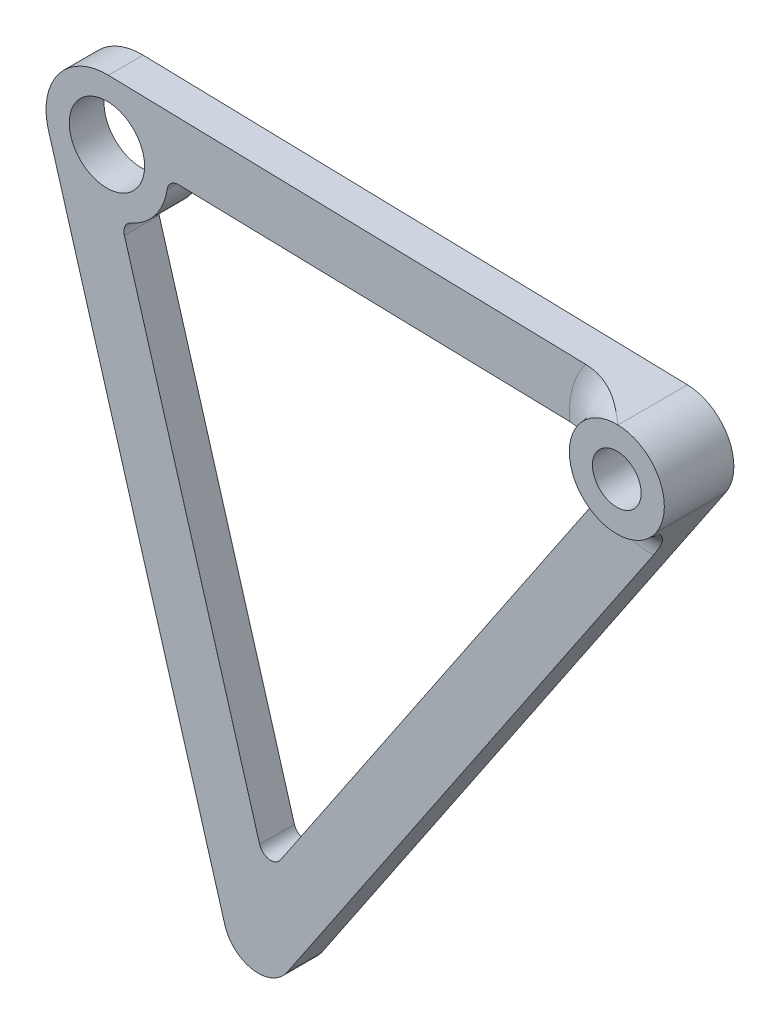
ISO-10303-21;
HEADER;
FILE_DESCRIPTION(('STEP AP214'),'2;1');
FILE_NAME('part.step','',(''),(''),'','','');
FILE_SCHEMA(('AUTOMOTIVE_DESIGN { 1 0 10303 214 1 1 1 1 }'));
ENDSEC;
DATA;
#1=APPLICATION_CONTEXT('core data for automotive mechanical design processes');
#2=APPLICATION_PROTOCOL_DEFINITION('international standard','automotive_design',2000,#1);
#3=PRODUCT_CONTEXT('',#1,'mechanical');
#4=PRODUCT('Part','Part','',(#3));
#5=PRODUCT_RELATED_PRODUCT_CATEGORY('part','',(#4));
#6=PRODUCT_DEFINITION_FORMATION('','',#4);
#7=PRODUCT_DEFINITION_CONTEXT('part definition',#1,'design');
#8=PRODUCT_DEFINITION('design','',#6,#7);
#9=PRODUCT_DEFINITION_SHAPE('','',#8);
#10=(LENGTH_UNIT() NAMED_UNIT(*) SI_UNIT(.MILLI.,.METRE.));
#11=(NAMED_UNIT(*) PLANE_ANGLE_UNIT() SI_UNIT($,.RADIAN.));
#12=(NAMED_UNIT(*) SI_UNIT($,.STERADIAN.) SOLID_ANGLE_UNIT());
#13=UNCERTAINTY_MEASURE_WITH_UNIT(LENGTH_MEASURE(1.E-05),#10,'distance_accuracy_value','');
#14=(GEOMETRIC_REPRESENTATION_CONTEXT(3) GLOBAL_UNCERTAINTY_ASSIGNED_CONTEXT((#13)) GLOBAL_UNIT_ASSIGNED_CONTEXT((#10,
#11,#12)) REPRESENTATION_CONTEXT('',''));
#15=CARTESIAN_POINT('',(0.,0.,0.));
#16=DIRECTION('',(0.,0.,1.));
#17=DIRECTION('',(1.,0.,0.));
#18=AXIS2_PLACEMENT_3D('',#15,#16,#17);
#19=CARTESIAN_POINT('',(47.,0.,-1.5));
#20=DIRECTION('',(0.,0.,1.));
#21=DIRECTION('',(-1.,0.,0.));
#22=AXIS2_PLACEMENT_3D('',#19,#20,#21);
#23=CYLINDRICAL_SURFACE('',#22,4.1);
#24=CARTESIAN_POINT('',(47.,0.,-1.5));
#25=DIRECTION('',(0.,0.,-1.));
#26=DIRECTION('',(-1.,0.,0.));
#27=AXIS2_PLACEMENT_3D('',#24,#25,#26);
#28=CIRCLE('',#27,4.1);
#29=CARTESIAN_POINT('',(43.6084392169331,-2.30376115401807,-1.5));
#30=VERTEX_POINT('',#29);
#31=CARTESIAN_POINT('',(43.1589140163209,-1.43389625356359,-1.5));
#32=VERTEX_POINT('',#31);
#33=EDGE_CURVE('E599',#30,#32,#28,.T.);
#34=ORIENTED_EDGE('',*,*,#33,.F.);
#35=DIRECTION('',(0.,0.,1.));
#36=VECTOR('',#35,1.);
#37=CARTESIAN_POINT('',(43.6084392169331,-2.30376115401808,-1.5));
#38=LINE('',#37,#36);
#39=CARTESIAN_POINT('',(43.6084392169331,-2.30376115401807,4.5));
#40=VERTEX_POINT('',#39);
#41=EDGE_CURVE('E572',#40,#30,#38,.F.);
#42=ORIENTED_EDGE('',*,*,#41,.F.);
#43=CARTESIAN_POINT('',(47.,0.,4.5));
#44=DIRECTION('',(0.,0.,-1.));
#45=DIRECTION('',(-1.,0.,0.));
#46=AXIS2_PLACEMENT_3D('',#43,#44,#45);
#47=CIRCLE('',#46,4.1);
#48=CARTESIAN_POINT('',(43.1589140163209,-1.43389625356359,4.5));
#49=VERTEX_POINT('',#48);
#50=EDGE_CURVE('E346',#40,#49,#47,.T.);
#51=ORIENTED_EDGE('',*,*,#50,.T.);
#52=DIRECTION('',(0.,0.,1.));
#53=VECTOR('',#52,1.);
#54=CARTESIAN_POINT('',(43.1589140163209,-1.43389625356359,-1.5));
#55=LINE('',#54,#53);
#56=EDGE_CURVE('E574',#32,#49,#55,.T.);
#57=ORIENTED_EDGE('',*,*,#56,.F.);
#58=EDGE_LOOP('',(#34,#42,#51,#57));
#59=FACE_BOUND('',#58,.T.);
#60=ADVANCED_FACE('F41',(#59),#23,.T.);
#61=CARTESIAN_POINT('',(0.,0.,-1.5));
#62=DIRECTION('',(0.,0.,-1.));
#63=DIRECTION('',(1.,0.,0.));
#64=AXIS2_PLACEMENT_3D('',#61,#62,#63);
#65=PLANE('',#64);
#66=CARTESIAN_POINT('',(0.,0.,-1.5));
#67=DIRECTION('',(0.,0.,1.));
#68=DIRECTION('',(1.,0.,0.));
#69=AXIS2_PLACEMENT_3D('',#66,#67,#68);
#70=CIRCLE('',#69,3.25);
#71=CARTESIAN_POINT('',(3.25,0.,-1.5));
#72=VERTEX_POINT('',#71);
#73=EDGE_CURVE('E220',#72,#72,#70,.T.);
#74=ORIENTED_EDGE('',*,*,#73,.T.);
#75=EDGE_LOOP('',(#74));
#76=FACE_BOUND('',#75,.T.);
#77=CARTESIAN_POINT('',(0.,0.,-1.5));
#78=DIRECTION('',(0.,0.,1.));
#79=DIRECTION('',(1.,0.,0.));
#80=AXIS2_PLACEMENT_3D('',#77,#78,#79);
#81=CIRCLE('',#80,5.25);
#82=CARTESIAN_POINT('',(0.128457446808512,5.24842821084174,-1.5));
#83=VERTEX_POINT('',#82);
#84=CARTESIAN_POINT('',(-5.0367083067548,-1.48123915444711,-1.5));
#85=VERTEX_POINT('',#84);
#86=EDGE_CURVE('E192',#83,#85,#81,.T.);
#87=ORIENTED_EDGE('',*,*,#86,.F.);
#88=DIRECTION('',(-0.999700611588903,0.0244680851063828,0.));
#89=VECTOR('',#88,1.);
#90=CARTESIAN_POINT('',(47.1003191489362,4.09877250751451,-1.5));
#91=LINE('',#90,#89);
#92=CARTESIAN_POINT('',(47.1003191489362,4.09877250751451,-1.5));
#93=VERTEX_POINT('',#92);
#94=EDGE_CURVE('E216',#93,#83,#91,.T.);
#95=ORIENTED_EDGE('',*,*,#94,.F.);
#96=CARTESIAN_POINT('',(47.,0.,-1.5));
#97=DIRECTION('',(0.,0.,1.));
#98=DIRECTION('',(1.,0.,0.));
#99=AXIS2_PLACEMENT_3D('',#96,#97,#98);
#100=CIRCLE('',#99,4.1);
#101=CARTESIAN_POINT('',(50.4014418271624,-2.28914689271571,-1.5));
#102=VERTEX_POINT('',#101);
#103=EDGE_CURVE('E213',#102,#93,#100,.T.);
#104=ORIENTED_EDGE('',*,*,#103,.F.);
#105=DIRECTION('',(0.558328510418464,0.829619957844493,0.));
#106=VECTOR('',#105,1.);
#107=CARTESIAN_POINT('',(15.5526422359154,-54.0709547501593,-1.5));
#108=LINE('',#107,#106);
#109=CARTESIAN_POINT('',(15.5526422359154,-54.0709547501592,-1.5));
#110=VERTEX_POINT('',#109);
#111=EDGE_CURVE('E210',#110,#102,#108,.T.);
#112=ORIENTED_EDGE('',*,*,#111,.F.);
#113=CARTESIAN_POINT('',(13.0637823623819,-52.3959692189039,-1.5));
#114=DIRECTION('',(0.,0.,1.));
#115=DIRECTION('',(1.,0.,0.));
#116=AXIS2_PLACEMENT_3D('',#113,#114,#115);
#117=CIRCLE('',#116,3.);
#118=CARTESIAN_POINT('',(10.1856633299506,-53.2423915928736,-1.5));
#119=VERTEX_POINT('',#118);
#120=EDGE_CURVE('E195',#119,#110,#117,.T.);
#121=ORIENTED_EDGE('',*,*,#120,.F.);
#122=DIRECTION('',(0.282140791323259,-0.959373010810438,0.));
#123=VECTOR('',#122,1.);
#124=CARTESIAN_POINT('',(-5.0367083067548,-1.48123915444711,-1.5));
#125=LINE('',#124,#123);
#126=EDGE_CURVE('E176',#85,#119,#125,.T.);
#127=ORIENTED_EDGE('',*,*,#126,.F.);
#128=EDGE_LOOP('',(#87,#95,#104,#112,#121,#127));
#129=FACE_BOUND('',#128,.T.);
#130=CARTESIAN_POINT('',(47.,0.,-1.5));
#131=DIRECTION('',(0.,0.,1.));
#132=DIRECTION('',(1.,0.,0.));
#133=AXIS2_PLACEMENT_3D('',#130,#131,#132);
#134=CIRCLE('',#133,2.09999999999999);
#135=CARTESIAN_POINT('',(49.1,0.,-1.5));
#136=VERTEX_POINT('',#135);
#137=EDGE_CURVE('E604',#136,#136,#134,.T.);
#138=ORIENTED_EDGE('',*,*,#137,.T.);
#139=EDGE_LOOP('',(#138));
#140=FACE_BOUND('',#139,.T.);
#141=DIRECTION('',(0.282140791323259,-0.959373010810438,0.));
#142=VECTOR('',#141,1.);
#143=CARTESIAN_POINT('',(13.7814187401358,-47.7475133134107,-1.5));
#144=LINE('',#143,#142);
#145=CARTESIAN_POINT('',(1.51079431856902,-6.0232881822954,-1.5));
#146=VERTEX_POINT('',#145);
#147=CARTESIAN_POINT('',(13.1808639182024,-45.7054261519874,-1.5));
#148=VERTEX_POINT('',#147);
#149=EDGE_CURVE('E594',#146,#148,#144,.T.);
#150=ORIENTED_EDGE('',*,*,#149,.T.);
#151=CARTESIAN_POINT('',(14.1402369290128,-45.4232853606641,-1.5));
#152=DIRECTION('',(0.,0.,1.));
#153=DIRECTION('',(1.,0.,0.));
#154=AXIS2_PLACEMENT_3D('',#151,#152,#153);
#155=CIRCLE('',#154,1.);
#156=CARTESIAN_POINT('',(14.9698568868573,-45.9816138710826,-1.5));
#157=VERTEX_POINT('',#156);
#158=EDGE_CURVE('E284',#157,#148,#155,.F.);
#159=ORIENTED_EDGE('',*,*,#158,.F.);
#160=DIRECTION('',(0.558328510418464,0.829619957844493,0.));
#161=VECTOR('',#160,1.);
#162=CARTESIAN_POINT('',(44.0200279962661,-2.81598417200135,-1.5));
#163=LINE('',#162,#161);
#164=CARTESIAN_POINT('',(43.6108492276881,-3.4239826288312,-1.5));
#165=VERTEX_POINT('',#164);
#166=EDGE_CURVE('E596',#157,#165,#163,.T.);
#167=ORIENTED_EDGE('',*,*,#166,.T.);
#168=CARTESIAN_POINT('',(42.7812292698436,-2.86565411841273,-1.5));
#169=DIRECTION('',(0.,0.,1.));
#170=DIRECTION('',(1.,0.,0.));
#171=AXIS2_PLACEMENT_3D('',#168,#169,#170);
#172=CIRCLE('',#171,1.);
#173=EDGE_CURVE('E11',#30,#165,#172,.F.);
#174=ORIENTED_EDGE('',*,*,#173,.F.);
#175=ORIENTED_EDGE('',*,*,#33,.T.);
#176=CARTESIAN_POINT('',(42.2220637763991,-1.78362704711569,-1.5));
#177=DIRECTION('',(0.,0.,1.));
#178=DIRECTION('',(1.,0.,0.));
#179=AXIS2_PLACEMENT_3D('',#176,#177,#178);
#180=CIRCLE('',#179,1.);
#181=CARTESIAN_POINT('',(42.2465318615055,-0.783926435526787,-1.5));
#182=VERTEX_POINT('',#181);
#183=EDGE_CURVE('E65',#182,#32,#180,.F.);
#184=ORIENTED_EDGE('',*,*,#183,.F.);
#185=DIRECTION('',(-0.999700611588903,0.024468085106383,0.));
#186=VECTOR('',#185,1.);
#187=CARTESIAN_POINT('',(42.9791762770487,-0.801858210004482,-1.5));
#188=LINE('',#187,#186);
#189=CARTESIAN_POINT('',(6.20909618803447,0.0981046774409536,-1.5));
#190=VERTEX_POINT('',#189);
#191=EDGE_CURVE('E560',#182,#190,#188,.T.);
#192=ORIENTED_EDGE('',*,*,#191,.T.);
#193=CARTESIAN_POINT('',(6.18462810292808,-0.901595934147949,-1.5));
#194=DIRECTION('',(0.,0.,1.));
#195=DIRECTION('',(1.,0.,0.));
#196=AXIS2_PLACEMENT_3D('',#193,#194,#195);
#197=CIRCLE('',#196,1.);
#198=CARTESIAN_POINT('',(5.19508760645959,-0.757340584684277,-1.5));
#199=VERTEX_POINT('',#198);
#200=EDGE_CURVE('E584',#199,#190,#197,.F.);
#201=ORIENTED_EDGE('',*,*,#200,.F.);
#202=CARTESIAN_POINT('',(0.,0.,-1.5));
#203=DIRECTION('',(0.,0.,-1.));
#204=DIRECTION('',(1.,0.,0.));
#205=AXIS2_PLACEMENT_3D('',#202,#203,#204);
#206=CIRCLE('',#205,5.25);
#207=CARTESIAN_POINT('',(2.07494055667874,-4.8225638084166,-1.5));
#208=VERTEX_POINT('',#207);
#209=EDGE_CURVE('E597',#199,#208,#206,.T.);
#210=ORIENTED_EDGE('',*,*,#209,.T.);
#211=CARTESIAN_POINT('',(2.47016732937945,-5.74114739097215,-1.5));
#212=DIRECTION('',(0.,0.,1.));
#213=DIRECTION('',(1.,0.,0.));
#214=AXIS2_PLACEMENT_3D('',#211,#212,#213);
#215=CIRCLE('',#214,1.);
#216=EDGE_CURVE('E579',#146,#208,#215,.F.);
#217=ORIENTED_EDGE('',*,*,#216,.F.);
#218=EDGE_LOOP('',(#150,#159,#167,#174,#175,#184,#192,#201,#210,#217));
#219=FACE_BOUND('',#218,.T.);
#220=ADVANCED_FACE('F189',(#76,#129,#140,#219),#65,.T.);
#221=CARTESIAN_POINT('',(0.,0.,1.5));
#222=DIRECTION('',(0.,0.,-1.));
#223=DIRECTION('',(1.,0.,0.));
#224=AXIS2_PLACEMENT_3D('',#221,#222,#223);
#225=PLANE('',#224);
#226=DIRECTION('',(0.282140791323259,-0.959373010810438,0.));
#227=VECTOR('',#226,1.);
#228=CARTESIAN_POINT('',(13.7814187401358,-47.7475133134107,1.5));
#229=LINE('',#228,#227);
#230=CARTESIAN_POINT('',(1.51079431856902,-6.0232881822954,1.5));
#231=VERTEX_POINT('',#230);
#232=CARTESIAN_POINT('',(13.1808639182024,-45.7054261519874,1.5));
#233=VERTEX_POINT('',#232);
#234=EDGE_CURVE('E348',#231,#233,#229,.T.);
#235=ORIENTED_EDGE('',*,*,#234,.F.);
#236=CARTESIAN_POINT('',(2.47016732937945,-5.74114739097215,1.5));
#237=DIRECTION('',(0.,0.,1.));
#238=DIRECTION('',(1.,0.,0.));
#239=AXIS2_PLACEMENT_3D('',#236,#237,#238);
#240=CIRCLE('',#239,1.);
#241=CARTESIAN_POINT('',(2.07494055667874,-4.8225638084166,1.5));
#242=VERTEX_POINT('',#241);
#243=EDGE_CURVE('E576',#242,#231,#240,.T.);
#244=ORIENTED_EDGE('',*,*,#243,.F.);
#245=CARTESIAN_POINT('',(0.,0.,1.5));
#246=DIRECTION('',(0.,0.,-1.));
#247=DIRECTION('',(1.,0.,0.));
#248=AXIS2_PLACEMENT_3D('',#245,#246,#247);
#249=CIRCLE('',#248,5.25);
#250=CARTESIAN_POINT('',(5.19508760645959,-0.757340584684277,1.5));
#251=VERTEX_POINT('',#250);
#252=EDGE_CURVE('E344',#251,#242,#249,.T.);
#253=ORIENTED_EDGE('',*,*,#252,.F.);
#254=CARTESIAN_POINT('',(6.18462810292808,-0.901595934147949,1.5));
#255=DIRECTION('',(0.,0.,1.));
#256=DIRECTION('',(1.,0.,0.));
#257=AXIS2_PLACEMENT_3D('',#254,#255,#256);
#258=CIRCLE('',#257,1.);
#259=CARTESIAN_POINT('',(6.20909618803447,0.0981046774409536,1.5));
#260=VERTEX_POINT('',#259);
#261=EDGE_CURVE('E581',#260,#251,#258,.T.);
#262=ORIENTED_EDGE('',*,*,#261,.F.);
#263=DIRECTION('',(-0.999700611588903,0.024468085106383,0.));
#264=VECTOR('',#263,1.);
#265=CARTESIAN_POINT('',(42.9791762770487,-0.801858210004482,1.5));
#266=LINE('',#265,#264);
#267=CARTESIAN_POINT('',(39.9373604895105,-0.727408513060585,1.5));
#268=VERTEX_POINT('',#267);
#269=EDGE_CURVE('E548',#268,#260,#266,.T.);
#270=ORIENTED_EDGE('',*,*,#269,.F.);
#271=CARTESIAN_POINT('',(47.,0.,1.5));
#272=DIRECTION('',(0.,0.,1.));
#273=DIRECTION('',(1.,0.,0.));
#274=AXIS2_PLACEMENT_3D('',#271,#272,#273);
#275=CIRCLE('',#274,7.1);
#276=CARTESIAN_POINT('',(41.3055038705639,4.24060300332827,1.5));
#277=VERTEX_POINT('',#276);
#278=EDGE_CURVE('E184',#277,#268,#275,.T.);
#279=ORIENTED_EDGE('',*,*,#278,.F.);
#280=DIRECTION('',(-0.999700611588903,0.0244680851063828,0.));
#281=VECTOR('',#280,1.);
#282=CARTESIAN_POINT('',(47.1003191489362,4.09877250751451,1.5));
#283=LINE('',#282,#281);
#284=CARTESIAN_POINT('',(0.128457446808512,5.24842821084174,1.5));
#285=VERTEX_POINT('',#284);
#286=EDGE_CURVE('E200',#277,#285,#283,.T.);
#287=ORIENTED_EDGE('',*,*,#286,.T.);
#288=CARTESIAN_POINT('',(0.,0.,1.5));
#289=DIRECTION('',(0.,0.,1.));
#290=DIRECTION('',(1.,0.,0.));
#291=AXIS2_PLACEMENT_3D('',#288,#289,#290);
#292=CIRCLE('',#291,5.25);
#293=CARTESIAN_POINT('',(-5.0367083067548,-1.48123915444711,1.5));
#294=VERTEX_POINT('',#293);
#295=EDGE_CURVE('E218',#285,#294,#292,.T.);
#296=ORIENTED_EDGE('',*,*,#295,.T.);
#297=DIRECTION('',(0.282140791323259,-0.959373010810438,0.));
#298=VECTOR('',#297,1.);
#299=CARTESIAN_POINT('',(-5.0367083067548,-1.48123915444711,1.5));
#300=LINE('',#299,#298);
#301=CARTESIAN_POINT('',(10.1856633299506,-53.2423915928736,1.5));
#302=VERTEX_POINT('',#301);
#303=EDGE_CURVE('E179',#294,#302,#300,.T.);
#304=ORIENTED_EDGE('',*,*,#303,.T.);
#305=CARTESIAN_POINT('',(13.0637823623819,-52.3959692189039,1.5));
#306=DIRECTION('',(0.,0.,1.));
#307=DIRECTION('',(1.,0.,0.));
#308=AXIS2_PLACEMENT_3D('',#305,#306,#307);
#309=CIRCLE('',#308,3.);
#310=CARTESIAN_POINT('',(15.5526422359154,-54.0709547501592,1.5));
#311=VERTEX_POINT('',#310);
#312=EDGE_CURVE('E222',#302,#311,#309,.T.);
#313=ORIENTED_EDGE('',*,*,#312,.T.);
#314=DIRECTION('',(0.558328510418464,0.829619957844493,0.));
#315=VECTOR('',#314,1.);
#316=CARTESIAN_POINT('',(15.5526422359154,-54.0709547501593,1.5));
#317=LINE('',#316,#315);
#318=CARTESIAN_POINT('',(47.1650623101173,-7.09808103882866,1.5));
#319=VERTEX_POINT('',#318);
#320=EDGE_CURVE('E203',#311,#319,#317,.T.);
#321=ORIENTED_EDGE('',*,*,#320,.T.);
#322=CARTESIAN_POINT('',(47.,0.,1.5));
#323=DIRECTION('',(0.,0.,1.));
#324=DIRECTION('',(1.,0.,0.));
#325=AXIS2_PLACEMENT_3D('',#322,#323,#324);
#326=CIRCLE('',#325,7.1);
#327=CARTESIAN_POINT('',(42.3211869053076,-5.34029100564149,1.5));
#328=VERTEX_POINT('',#327);
#329=EDGE_CURVE('E239',#328,#319,#326,.T.);
#330=ORIENTED_EDGE('',*,*,#329,.F.);
#331=DIRECTION('',(0.558328510418464,0.829619957844493,0.));
#332=VECTOR('',#331,1.);
#333=CARTESIAN_POINT('',(44.0200279962661,-2.81598417200135,1.5));
#334=LINE('',#333,#332);
#335=CARTESIAN_POINT('',(14.9698568868573,-45.9816138710826,1.5));
#336=VERTEX_POINT('',#335);
#337=EDGE_CURVE('E542',#336,#328,#334,.T.);
#338=ORIENTED_EDGE('',*,*,#337,.F.);
#339=CARTESIAN_POINT('',(14.1402369290128,-45.4232853606641,1.5));
#340=DIRECTION('',(0.,0.,1.));
#341=DIRECTION('',(1.,0.,0.));
#342=AXIS2_PLACEMENT_3D('',#339,#340,#341);
#343=CIRCLE('',#342,1.);
#344=EDGE_CURVE('E586',#233,#336,#343,.T.);
#345=ORIENTED_EDGE('',*,*,#344,.F.);
#346=EDGE_LOOP('',(#235,#244,#253,#262,#270,#279,#287,#296,#304,#313,#321,#330,#338,#345));
#347=FACE_BOUND('',#346,.T.);
#348=CARTESIAN_POINT('',(0.,0.,1.5));
#349=DIRECTION('',(0.,0.,1.));
#350=DIRECTION('',(1.,0.,0.));
#351=AXIS2_PLACEMENT_3D('',#348,#349,#350);
#352=CIRCLE('',#351,3.25);
#353=CARTESIAN_POINT('',(3.25,0.,1.5));
#354=VERTEX_POINT('',#353);
#355=EDGE_CURVE('E206',#354,#354,#352,.T.);
#356=ORIENTED_EDGE('',*,*,#355,.F.);
#357=EDGE_LOOP('',(#356));
#358=FACE_BOUND('',#357,.T.);
#359=ADVANCED_FACE('F311',(#347,#358),#225,.F.);
#360=CARTESIAN_POINT('',(0.,0.,-1.5));
#361=DIRECTION('',(0.,0.,1.));
#362=DIRECTION('',(-1.,0.,0.));
#363=AXIS2_PLACEMENT_3D('',#360,#361,#362);
#364=CYLINDRICAL_SURFACE('',#363,5.25);
#365=ORIENTED_EDGE('',*,*,#295,.F.);
#366=DIRECTION('',(0.,0.,1.));
#367=VECTOR('',#366,1.);
#368=CARTESIAN_POINT('',(0.128457446808512,5.24842821084174,-1.5));
#369=LINE('',#368,#367);
#370=EDGE_CURVE('E198',#83,#285,#369,.T.);
#371=ORIENTED_EDGE('',*,*,#370,.F.);
#372=ORIENTED_EDGE('',*,*,#86,.T.);
#373=DIRECTION('',(0.,0.,1.));
#374=VECTOR('',#373,1.);
#375=CARTESIAN_POINT('',(-5.0367083067548,-1.48123915444711,-1.5));
#376=LINE('',#375,#374);
#377=EDGE_CURVE('E173',#85,#294,#376,.T.);
#378=ORIENTED_EDGE('',*,*,#377,.T.);
#379=EDGE_LOOP('',(#365,#371,#372,#378));
#380=FACE_BOUND('',#379,.T.);
#381=ADVANCED_FACE('F197',(#380),#364,.T.);
#382=CARTESIAN_POINT('',(-5.0367083067548,-1.48123915444711,-1.5));
#383=DIRECTION('',(0.959373010810438,0.282140791323259,0.));
#384=DIRECTION('',(-0.282140791323259,0.959373010810438,0.));
#385=AXIS2_PLACEMENT_3D('',#382,#383,#384);
#386=PLANE('',#385);
#387=ORIENTED_EDGE('',*,*,#303,.F.);
#388=ORIENTED_EDGE('',*,*,#377,.F.);
#389=ORIENTED_EDGE('',*,*,#126,.T.);
#390=DIRECTION('',(0.,0.,1.));
#391=VECTOR('',#390,1.);
#392=CARTESIAN_POINT('',(10.1856633299506,-53.2423915928736,-1.5));
#393=LINE('',#392,#391);
#394=EDGE_CURVE('E185',#119,#302,#393,.T.);
#395=ORIENTED_EDGE('',*,*,#394,.T.);
#396=EDGE_LOOP('',(#387,#388,#389,#395));
#397=FACE_BOUND('',#396,.T.);
#398=ADVANCED_FACE('F175',(#397),#386,.F.);
#399=CARTESIAN_POINT('',(13.0637823623819,-52.3959692189039,-1.5));
#400=DIRECTION('',(0.,0.,1.));
#401=DIRECTION('',(-1.,0.,0.));
#402=AXIS2_PLACEMENT_3D('',#399,#400,#401);
#403=CYLINDRICAL_SURFACE('',#402,3.);
#404=ORIENTED_EDGE('',*,*,#312,.F.);
#405=ORIENTED_EDGE('',*,*,#394,.F.);
#406=ORIENTED_EDGE('',*,*,#120,.T.);
#407=DIRECTION('',(0.,0.,1.));
#408=VECTOR('',#407,1.);
#409=CARTESIAN_POINT('',(15.5526422359154,-54.0709547501592,-1.5));
#410=LINE('',#409,#408);
#411=EDGE_CURVE('E234',#110,#311,#410,.T.);
#412=ORIENTED_EDGE('',*,*,#411,.T.);
#413=EDGE_LOOP('',(#404,#405,#406,#412));
#414=FACE_BOUND('',#413,.T.);
#415=ADVANCED_FACE('F326',(#414),#403,.T.);
#416=CARTESIAN_POINT('',(15.5526422359154,-54.0709547501593,-1.5));
#417=DIRECTION('',(-0.829619957844493,0.558328510418464,0.));
#418=DIRECTION('',(-0.558328510418464,-0.829619957844494,0.));
#419=AXIS2_PLACEMENT_3D('',#416,#417,#418);
#420=PLANE('',#419);
#421=ORIENTED_EDGE('',*,*,#320,.F.);
#422=ORIENTED_EDGE('',*,*,#411,.F.);
#423=ORIENTED_EDGE('',*,*,#111,.T.);
#424=DIRECTION('',(0.,0.,1.));
#425=VECTOR('',#424,1.);
#426=CARTESIAN_POINT('',(50.4014418271624,-2.28914689271571,-1.5));
#427=LINE('',#426,#425);
#428=CARTESIAN_POINT('',(50.4014418271624,-2.2891468927157,4.5));
#429=VERTEX_POINT('',#428);
#430=EDGE_CURVE('E231',#102,#429,#427,.T.);
#431=ORIENTED_EDGE('',*,*,#430,.T.);
#432=CARTESIAN_POINT('',(47.1650623101173,-7.09808103882865,1.5));
#433=CARTESIAN_POINT('',(47.2363930602177,-6.9920907252641,1.49999294841604));
#434=CARTESIAN_POINT('',(47.3076876111188,-6.88615420006532,1.50543769285002));
#435=CARTESIAN_POINT('',(47.4497408814415,-6.67507734130261,1.52643615494527));
#436=CARTESIAN_POINT('',(47.5205000860848,-6.56993628674802,1.54197922068617));
#437=CARTESIAN_POINT('',(47.6604508082962,-6.36198360280885,1.58217611628572));
#438=CARTESIAN_POINT('',(47.7296509594415,-6.25915914479753,1.60673501398968));
#439=CARTESIAN_POINT('',(47.8669651080827,-6.05512414375182,1.66420013503758));
#440=CARTESIAN_POINT('',(47.9350788740056,-5.95391394481123,1.69710811344207));
#441=CARTESIAN_POINT('',(48.1129503188136,-5.68961488468849,1.79385491692366));
#442=CARTESIAN_POINT('',(48.2216389947548,-5.528114454261,1.86405393823637));
#443=CARTESIAN_POINT('',(48.4350914404162,-5.21094560891825,2.02145684501459));
#444=CARTESIAN_POINT('',(48.5398531716585,-5.0552802229758,2.10866942038795));
#445=CARTESIAN_POINT('',(48.8491892179887,-4.59563799993415,2.39221780608383));
#446=CARTESIAN_POINT('',(49.0476822966213,-4.30069726799099,2.60978784015491));
#447=CARTESIAN_POINT('',(49.4429239818752,-3.71340791389191,3.09404088743079));
#448=CARTESIAN_POINT('',(49.6387795846286,-3.42238620558227,3.36295064544719));
#449=CARTESIAN_POINT('',(50.0217707801127,-2.85329984598713,3.91846483691301));
#450=CARTESIAN_POINT('',(50.2089188359539,-2.57521667577395,4.20504252389094));
#451=CARTESIAN_POINT('',(50.3978195387798,-2.29452924858542,4.49445039728559));
#452=CARTESIAN_POINT('',(50.3996306838312,-2.29183806937264,4.49722520011662));
#453=CARTESIAN_POINT('',(50.4014418271624,-2.2891468927157,4.5));
#454=B_SPLINE_CURVE_WITH_KNOTS('',3,(#432,#433,#434,#435,#436,#437,#438,#439,#440,#441,#442,
#443,#444,#445,#446,#447,#448,#449,#450,#451,#452,#453),.UNSPECIFIED.,.F.,.F.,(4,2,2,2,2,2,2,2,
2,2,4),(0.,0.383062403442689,0.765721399237589,1.14446163732017,1.52328155646243,
2.14305439451332,2.76314462285962,4.00966185663654,5.33448962406448,6.65735884377311,
6.67016509224793),.UNSPECIFIED.);
#455=EDGE_CURVE('E250',#319,#429,#454,.T.);
#456=ORIENTED_EDGE('',*,*,#455,.F.);
#457=EDGE_LOOP('',(#421,#422,#423,#431,#456));
#458=FACE_BOUND('',#457,.T.);
#459=ADVANCED_FACE('F318',(#458),#420,.F.);
#460=ORIENTED_EDGE('',*,*,#430,.F.);
#461=ORIENTED_EDGE('',*,*,#103,.T.);
#462=DIRECTION('',(0.,0.,1.));
#463=VECTOR('',#462,1.);
#464=CARTESIAN_POINT('',(47.1003191489362,4.09877250751451,-1.5));
#465=LINE('',#464,#463);
#466=CARTESIAN_POINT('',(47.1003191489362,4.0987725075145,4.5));
#467=VERTEX_POINT('',#466);
#468=EDGE_CURVE('E228',#93,#467,#465,.T.);
#469=ORIENTED_EDGE('',*,*,#468,.T.);
#470=EDGE_CURVE('E331',#467,#429,#47,.T.);
#471=ORIENTED_EDGE('',*,*,#470,.T.);
#472=EDGE_LOOP('',(#460,#461,#469,#471));
#473=FACE_BOUND('',#472,.T.);
#474=ADVANCED_FACE('F307',(#473),#23,.T.);
#475=CARTESIAN_POINT('',(47.1003191489362,4.09877250751451,-1.5));
#476=DIRECTION('',(-0.0244680851063828,-0.999700611588903,0.));
#477=DIRECTION('',(0.999700611588903,-0.0244680851063828,0.));
#478=AXIS2_PLACEMENT_3D('',#475,#476,#477);
#479=PLANE('',#478);
#480=ORIENTED_EDGE('',*,*,#468,.F.);
#481=ORIENTED_EDGE('',*,*,#94,.T.);
#482=ORIENTED_EDGE('',*,*,#370,.T.);
#483=ORIENTED_EDGE('',*,*,#286,.F.);
#484=CARTESIAN_POINT('',(41.3055038705639,4.24060300332827,1.5));
#485=CARTESIAN_POINT('',(41.4332232923196,4.23747701776317,1.49999294841604));
#486=CARTESIAN_POINT('',(41.5608778985394,4.23435261858505,1.50543769285001));
#487=CARTESIAN_POINT('',(41.8152276918418,4.22812730240822,1.52643615494524));
#488=CARTESIAN_POINT('',(41.9419237477254,4.22502636414524,1.54197922068613));
#489=CARTESIAN_POINT('',(42.1925088781214,4.21889318964695,1.58217611628566));
#490=CARTESIAN_POINT('',(42.3164134112613,4.21586057505535,1.60673501398963));
#491=CARTESIAN_POINT('',(42.5622776933369,4.20984294526828,1.66420013503754));
#492=CARTESIAN_POINT('',(42.6842370276361,4.20685794022121,1.69710811344205));
#493=CARTESIAN_POINT('',(43.002720122876,4.19906293500771,1.79385491692368));
#494=CARTESIAN_POINT('',(43.1973298083636,4.19429978262805,1.86405393823643));
#495=CARTESIAN_POINT('',(43.579521540455,4.18494548223115,2.0214568450147));
#496=CARTESIAN_POINT('',(43.7670999371154,4.18035442354778,2.10866942038807));
#497=CARTESIAN_POINT('',(44.3209735597806,4.16679813801544,2.39221780608404));
#498=CARTESIAN_POINT('',(44.676380185812,4.15809941414522,2.60978784015533));
#499=CARTESIAN_POINT('',(45.3840699188293,4.14077841582267,3.09404088743038));
#500=CARTESIAN_POINT('',(45.7347540809358,4.13219527620626,3.36295064544568));
#501=CARTESIAN_POINT('',(46.4205090177026,4.11541114107577,3.91846483691433));
#502=CARTESIAN_POINT('',(46.755602107862,4.10720959938063,4.20504252389621));
#503=CARTESIAN_POINT('',(47.0938333545625,4.09893125000889,4.49445039728566));
#504=CARTESIAN_POINT('',(47.0970762532893,4.09885187872401,4.49722520011665));
#505=CARTESIAN_POINT('',(47.1003191489362,4.09877250751451,4.5));
#506=B_SPLINE_CURVE_WITH_KNOTS('',3,(#484,#485,#486,#487,#488,#489,#490,#491,#492,#493,#494,
#495,#496,#497,#498,#499,#500,#501,#502,#503,#504,#505),.UNSPECIFIED.,.F.,.F.,(4,2,2,2,2,2,2,2,
2,2,4),(0.,0.383062403442481,0.765721399237175,1.14446163731997,1.52328155646243,
2.14305439451354,2.76314462286005,4.00966185663654,5.33448962406426,6.65735884377304,
6.67016509224793),.UNSPECIFIED.);
#507=EDGE_CURVE('E336',#467,#277,#506,.F.);
#508=ORIENTED_EDGE('',*,*,#507,.F.);
#509=EDGE_LOOP('',(#480,#481,#482,#483,#508));
#510=FACE_BOUND('',#509,.T.);
#511=ADVANCED_FACE('F317',(#510),#479,.F.);
#512=CARTESIAN_POINT('',(0.,0.,-1.5));
#513=DIRECTION('',(0.,0.,1.));
#514=DIRECTION('',(-1.,0.,0.));
#515=AXIS2_PLACEMENT_3D('',#512,#513,#514);
#516=CYLINDRICAL_SURFACE('',#515,3.25);
#517=ORIENTED_EDGE('',*,*,#73,.F.);
#518=EDGE_LOOP('',(#517));
#519=FACE_BOUND('',#518,.T.);
#520=ORIENTED_EDGE('',*,*,#355,.T.);
#521=EDGE_LOOP('',(#520));
#522=FACE_BOUND('',#521,.T.);
#523=ADVANCED_FACE('F324',(#519,#522),#516,.F.);
#524=CARTESIAN_POINT('',(47.,0.,-1.5));
#525=DIRECTION('',(0.,0.,1.));
#526=DIRECTION('',(-1.,0.,0.));
#527=AXIS2_PLACEMENT_3D('',#524,#525,#526);
#528=CYLINDRICAL_SURFACE('',#527,2.09999999999999);
#529=ORIENTED_EDGE('',*,*,#137,.F.);
#530=EDGE_LOOP('',(#529));
#531=FACE_BOUND('',#530,.T.);
#532=CARTESIAN_POINT('',(47.,0.,4.5));
#533=DIRECTION('',(0.,0.,-1.));
#534=DIRECTION('',(-1.,0.,0.));
#535=AXIS2_PLACEMENT_3D('',#532,#533,#534);
#536=CIRCLE('',#535,2.09999999999999);
#537=CARTESIAN_POINT('',(44.9,0.,4.5));
#538=VERTEX_POINT('',#537);
#539=EDGE_CURVE('E354',#538,#538,#536,.T.);
#540=ORIENTED_EDGE('',*,*,#539,.F.);
#541=EDGE_LOOP('',(#540));
#542=FACE_BOUND('',#541,.T.);
#543=ADVANCED_FACE('F358',(#531,#542),#528,.F.);
#544=CARTESIAN_POINT('',(0.,0.,-1.5));
#545=DIRECTION('',(0.,0.,1.));
#546=DIRECTION('',(-1.,0.,0.));
#547=AXIS2_PLACEMENT_3D('',#544,#545,#546);
#548=CYLINDRICAL_SURFACE('',#547,5.25);
#549=ORIENTED_EDGE('',*,*,#209,.F.);
#550=DIRECTION('',(0.,0.,1.));
#551=VECTOR('',#550,1.);
#552=CARTESIAN_POINT('',(5.19508760645959,-0.757340584684277,-1.5));
#553=LINE('',#552,#551);
#554=EDGE_CURVE('E387',#251,#199,#553,.F.);
#555=ORIENTED_EDGE('',*,*,#554,.F.);
#556=ORIENTED_EDGE('',*,*,#252,.T.);
#557=DIRECTION('',(0.,0.,1.));
#558=VECTOR('',#557,1.);
#559=CARTESIAN_POINT('',(2.07494055667874,-4.82256380841661,-1.5));
#560=LINE('',#559,#558);
#561=EDGE_CURVE('E619',#208,#242,#560,.T.);
#562=ORIENTED_EDGE('',*,*,#561,.F.);
#563=EDGE_LOOP('',(#549,#555,#556,#562));
#564=FACE_BOUND('',#563,.T.);
#565=ADVANCED_FACE('F360',(#564),#548,.T.);
#566=CARTESIAN_POINT('',(13.7814187401358,-47.7475133134107,-1.5));
#567=DIRECTION('',(0.959373010810438,0.282140791323258,0.));
#568=DIRECTION('',(-0.282140791323259,0.959373010810439,0.));
#569=AXIS2_PLACEMENT_3D('',#566,#567,#568);
#570=PLANE('',#569);
#571=ORIENTED_EDGE('',*,*,#234,.T.);
#572=DIRECTION('',(0.,0.,1.));
#573=VECTOR('',#572,1.);
#574=CARTESIAN_POINT('',(13.1808639182024,-45.7054261519874,1.5));
#575=LINE('',#574,#573);
#576=EDGE_CURVE('E566',#148,#233,#575,.T.);
#577=ORIENTED_EDGE('',*,*,#576,.F.);
#578=ORIENTED_EDGE('',*,*,#149,.F.);
#579=DIRECTION('',(0.,0.,-1.));
#580=VECTOR('',#579,1.);
#581=CARTESIAN_POINT('',(1.51079431856902,-6.02328818229541,-1.5));
#582=LINE('',#581,#580);
#583=EDGE_CURVE('E562',#231,#146,#582,.T.);
#584=ORIENTED_EDGE('',*,*,#583,.F.);
#585=EDGE_LOOP('',(#571,#577,#578,#584));
#586=FACE_BOUND('',#585,.T.);
#587=ADVANCED_FACE('F367',(#586),#570,.T.);
#588=CARTESIAN_POINT('',(44.0200279962661,-2.81598417200135,-1.5));
#589=DIRECTION('',(-0.829619957844493,0.558328510418464,0.));
#590=DIRECTION('',(-0.558328510418464,-0.829619957844494,0.));
#591=AXIS2_PLACEMENT_3D('',#588,#589,#590);
#592=PLANE('',#591);
#593=ORIENTED_EDGE('',*,*,#337,.T.);
#594=CARTESIAN_POINT('',(44.0200279962661,-2.81598417200136,4.5));
#595=CARTESIAN_POINT('',(44.0200337897389,-2.81597556348401,4.41683052112646));
#596=CARTESIAN_POINT('',(44.018048770211,-2.81892510266456,4.33366608103657));
#597=CARTESIAN_POINT('',(44.0101417842937,-2.83067408771716,4.16795001340954));
#598=CARTESIAN_POINT('',(44.0042203186238,-2.83947278957061,4.0853983092821));
#599=CARTESIAN_POINT('',(43.9884978251695,-2.86283483201224,3.92162156301453));
#600=CARTESIAN_POINT('',(43.9787030884697,-2.87738882468212,3.84039459087034));
#601=CARTESIAN_POINT('',(43.9553296312722,-2.91211942900016,3.67972947820321));
#602=CARTESIAN_POINT('',(43.9417508924436,-2.9322960678864,3.60029134634805));
#603=CARTESIAN_POINT('',(43.8954903697967,-3.00103454735145,3.36547990058257));
#604=CARTESIAN_POINT('',(43.857271390755,-3.05782410258597,3.21347665496682));
#605=CARTESIAN_POINT('',(43.7673440217262,-3.19144711969973,2.92296712283594));
#606=CARTESIAN_POINT('',(43.7156339476471,-3.26828308397008,2.78446252432244));
#607=CARTESIAN_POINT('',(43.5994415156378,-3.44093334048867,2.52263312944131));
#608=CARTESIAN_POINT('',(43.5347899361619,-3.53699907891789,2.39954891448539));
#609=CARTESIAN_POINT('',(43.3950417206012,-3.7446508583611,2.17412139404518));
#610=CARTESIAN_POINT('',(43.3199427740659,-3.8562403324721,2.07178268879603));
#611=CARTESIAN_POINT('',(43.1599345097395,-4.09399650474029,1.88890019593664));
#612=CARTESIAN_POINT('',(43.0748704961694,-4.22039306525124,1.80879067070087));
#613=CARTESIAN_POINT('',(42.8984837882176,-4.48248595587865,1.67516720559397));
#614=CARTESIAN_POINT('',(42.8071642924282,-4.61817753320894,1.62163978741175));
#615=CARTESIAN_POINT('',(42.6496936580352,-4.85216304286705,1.55489630238778));
#616=CARTESIAN_POINT('',(42.5844830645518,-4.94905941983358,1.53433527494176));
#617=CARTESIAN_POINT('',(42.4532533693632,-5.1440535355895,1.50688592563036));
#618=CARTESIAN_POINT('',(42.3872353680936,-5.24214963924207,1.49998071467556));
#619=CARTESIAN_POINT('',(42.3211869053076,-5.34029100564149,1.5));
#620=B_SPLINE_CURVE_WITH_KNOTS('',3,(#594,#595,#596,#597,#598,#599,#600,#601,#602,#603,#604,
#605,#606,#607,#608,#609,#610,#611,#612,#613,#614,#615,#616,#617,#618,#619),.UNSPECIFIED.,.F.,
.F.,(4,2,2,2,2,2,2,2,2,2,2,2,4),(0.,0.249423683355806,0.498815645870778,0.747804191269521,
0.996793942877589,1.49437392081679,1.99201604135507,2.49664909530185,3.00139392753026,
3.51539817810731,4.02914153887731,4.38416629060565,4.73875168347318),.UNSPECIFIED.);
#621=CARTESIAN_POINT('',(43.6108492276881,-3.42398262883121,2.55295192865384));
#622=VERTEX_POINT('',#621);
#623=EDGE_CURVE('E242',#622,#328,#620,.T.);
#624=ORIENTED_EDGE('',*,*,#623,.F.);
#625=DIRECTION('',(0.,0.,1.));
#626=VECTOR('',#625,1.);
#627=CARTESIAN_POINT('',(43.6108492276881,-3.4239826288312,-1.5));
#628=LINE('',#627,#626);
#629=EDGE_CURVE('E564',#165,#622,#628,.T.);
#630=ORIENTED_EDGE('',*,*,#629,.F.);
#631=ORIENTED_EDGE('',*,*,#166,.F.);
#632=DIRECTION('',(0.,0.,1.));
#633=VECTOR('',#632,1.);
#634=CARTESIAN_POINT('',(14.9698568868573,-45.9816138710826,-1.5));
#635=LINE('',#634,#633);
#636=EDGE_CURVE('E545',#336,#157,#635,.F.);
#637=ORIENTED_EDGE('',*,*,#636,.F.);
#638=EDGE_LOOP('',(#593,#624,#630,#631,#637));
#639=FACE_BOUND('',#638,.T.);
#640=ADVANCED_FACE('F257',(#639),#592,.T.);
#641=CARTESIAN_POINT('',(42.9791762770487,-0.801858210004482,-1.5));
#642=DIRECTION('',(-0.024468085106383,-0.999700611588903,0.));
#643=DIRECTION('',(0.999700611588903,-0.024468085106383,0.));
#644=AXIS2_PLACEMENT_3D('',#641,#642,#643);
#645=PLANE('',#644);
#646=ORIENTED_EDGE('',*,*,#191,.F.);
#647=DIRECTION('',(0.,0.,1.));
#648=VECTOR('',#647,1.);
#649=CARTESIAN_POINT('',(42.2465318615055,-0.783926435526787,-1.5));
#650=LINE('',#649,#648);
#651=CARTESIAN_POINT('',(42.2465318615055,-0.783926435526787,2.55295192865385));
#652=VERTEX_POINT('',#651);
#653=EDGE_CURVE('E558',#652,#182,#650,.F.);
#654=ORIENTED_EDGE('',*,*,#653,.F.);
#655=CARTESIAN_POINT('',(39.9373604895105,-0.727408513060585,1.5));
#656=CARTESIAN_POINT('',(40.0234397220935,-0.729515337808231,1.4999919298512));
#657=CARTESIAN_POINT('',(40.1095139489414,-0.731622040038444,1.50364742599899));
#658=CARTESIAN_POINT('',(40.2810411054722,-0.735820237994311,1.5182095657547));
#659=CARTESIAN_POINT('',(40.3664940807204,-0.737911734835195,1.52911567203391));
#660=CARTESIAN_POINT('',(40.5361111648435,-0.742063182980478,1.55809124336785));
#661=CARTESIAN_POINT('',(40.6202762683671,-0.744123158629319,1.5761548569011));
#662=CARTESIAN_POINT('',(40.7867673816533,-0.748198097348089,1.61929038245574));
#663=CARTESIAN_POINT('',(40.8690933987441,-0.750213060597384,1.64436226654516));
#664=CARTESIAN_POINT('',(41.112501420537,-0.756170572400181,1.72986959668255));
#665=CARTESIAN_POINT('',(41.2701041067918,-0.76002796319856,1.800612317137));
#666=CARTESIAN_POINT('',(41.5711299000191,-0.767395693739602,1.96746976726909));
#667=CARTESIAN_POINT('',(41.7145544745351,-0.770906069400996,2.06358186723368));
#668=CARTESIAN_POINT('',(41.9834648567041,-0.777487762000388,2.27871973131016));
#669=CARTESIAN_POINT('',(42.1089223877713,-0.780558386857274,2.39778093681913));
#670=CARTESIAN_POINT('',(42.3378980267864,-0.786162660134456,2.65547158321684));
#671=CARTESIAN_POINT('',(42.441412078289,-0.788696209271578,2.79410463425616));
#672=CARTESIAN_POINT('',(42.6224543313309,-0.793127293142019,3.08580638722283));
#673=CARTESIAN_POINT('',(42.7001926597143,-0.795029970816578,3.23874463541952));
#674=CARTESIAN_POINT('',(42.8282171850114,-0.798163423916796,3.55564802431853));
#675=CARTESIAN_POINT('',(42.8785290350742,-0.799394827213869,3.71960269906383));
#676=CARTESIAN_POINT('',(42.9358145125441,-0.800796912920173,3.98736396517922));
#677=CARTESIAN_POINT('',(42.9520606549663,-0.801194543961737,4.08927284494386));
#678=CARTESIAN_POINT('',(42.9737411548337,-0.801725183144863,4.29410416410424));
#679=CARTESIAN_POINT('',(42.9791891220915,-0.801858524392208,4.39702516311965));
#680=CARTESIAN_POINT('',(42.9791762770486,-0.801858210004482,4.5));
#681=B_SPLINE_CURVE_WITH_KNOTS('',3,(#655,#656,#657,#658,#659,#660,#661,#662,#663,#664,#665,
#666,#667,#668,#669,#670,#671,#672,#673,#674,#675,#676,#677,#678,#679,#680),.UNSPECIFIED.,.F.,
.F.,(4,2,2,2,2,2,2,2,2,2,2,2,4),(0.,0.258228824168251,0.516438513630037,0.7744375414228,
1.03243554095645,1.54815880336284,2.06382862843714,2.58030130175723,3.09686936650039,
3.60911637300934,4.12088342745036,4.42994935412777,4.73862549170783),.UNSPECIFIED.);
#682=EDGE_CURVE('E338',#268,#652,#681,.T.);
#683=ORIENTED_EDGE('',*,*,#682,.F.);
#684=ORIENTED_EDGE('',*,*,#269,.T.);
#685=DIRECTION('',(0.,0.,-1.));
#686=VECTOR('',#685,1.);
#687=CARTESIAN_POINT('',(6.20909618803447,0.0981046774409537,1.5));
#688=LINE('',#687,#686);
#689=EDGE_CURVE('E561',#190,#260,#688,.F.);
#690=ORIENTED_EDGE('',*,*,#689,.F.);
#691=EDGE_LOOP('',(#646,#654,#683,#684,#690));
#692=FACE_BOUND('',#691,.T.);
#693=ADVANCED_FACE('F389',(#692),#645,.T.);
#694=CARTESIAN_POINT('',(47.,0.,4.5));
#695=DIRECTION('',(0.,0.,1.));
#696=DIRECTION('',(-1.,0.,0.));
#697=AXIS2_PLACEMENT_3D('',#694,#695,#696);
#698=PLANE('',#697);
#699=ORIENTED_EDGE('',*,*,#470,.F.);
#700=EDGE_CURVE('E342',#49,#467,#47,.T.);
#701=ORIENTED_EDGE('',*,*,#700,.F.);
#702=ORIENTED_EDGE('',*,*,#50,.F.);
#703=EDGE_CURVE('E343',#429,#40,#47,.T.);
#704=ORIENTED_EDGE('',*,*,#703,.F.);
#705=EDGE_LOOP('',(#699,#701,#702,#704));
#706=FACE_BOUND('',#705,.T.);
#707=ORIENTED_EDGE('',*,*,#539,.T.);
#708=EDGE_LOOP('',(#707));
#709=FACE_BOUND('',#708,.T.);
#710=ADVANCED_FACE('F267',(#706,#709),#698,.T.);
#711=CARTESIAN_POINT('',(47.,0.,4.5));
#712=DIRECTION('',(0.,0.,-1.));
#713=DIRECTION('',(1.,0.,0.));
#714=AXIS2_PLACEMENT_3D('',#711,#712,#713);
#715=TOROIDAL_SURFACE('',#714,7.1,3.);
#716=ORIENTED_EDGE('',*,*,#455,.T.);
#717=ORIENTED_EDGE('',*,*,#703,.T.);
#718=CARTESIAN_POINT('',(43.6108492276881,-3.4239826288312,2.55295192865384));
#719=CARTESIAN_POINT('',(43.6348196046855,-3.38831627342858,2.60241824423347));
#720=CARTESIAN_POINT('',(43.6557758491197,-3.35227009408616,2.65297653531359));
#721=CARTESIAN_POINT('',(43.6922281226476,-3.28005282927388,2.75578366581224));
#722=CARTESIAN_POINT('',(43.7077352638195,-3.24388215168595,2.80802882476747));
#723=CARTESIAN_POINT('',(43.7338737263584,-3.1721111703199,2.91361133993597));
#724=CARTESIAN_POINT('',(43.7445331584901,-3.13650876403179,2.9669404760117));
#725=CARTESIAN_POINT('',(43.7616344787811,-3.06596287000279,3.07473808174811));
#726=CARTESIAN_POINT('',(43.7680734390422,-3.031019855994,3.12920731536097));
#727=CARTESIAN_POINT('',(43.7800577542369,-2.94026808237244,3.27371065568985));
#728=CARTESIAN_POINT('',(43.7824719211554,-2.88521520733593,3.36448549947726));
#729=CARTESIAN_POINT('',(43.7788319337521,-2.77814153388331,3.54763544068582));
#730=CARTESIAN_POINT('',(43.7727737564242,-2.7261221881281,3.64001127774794));
#731=CARTESIAN_POINT('',(43.7532804980739,-2.62532834000819,3.82600955065804));
#732=CARTESIAN_POINT('',(43.7398284390461,-2.57656159643635,3.91963436983908));
#733=CARTESIAN_POINT('',(43.7063173841635,-2.48264380728585,4.10744897791735));
#734=CARTESIAN_POINT('',(43.6862613488341,-2.43749115278579,4.20163849512138));
#735=CARTESIAN_POINT('',(43.6472760569225,-2.36456074152212,4.36068463904534));
#736=CARTESIAN_POINT('',(43.6299646411334,-2.3357735954192,4.42548014151583));
#737=CARTESIAN_POINT('',(43.6103221591299,-2.30654072018671,4.49351449984473));
#738=CARTESIAN_POINT('',(43.6093824320418,-2.3051497472478,4.49675725848342));
#739=CARTESIAN_POINT('',(43.6084392169331,-2.30376115401808,4.5));
#740=B_SPLINE_CURVE_WITH_KNOTS('',3,(#718,#719,#720,#721,#722,#723,#724,#725,#726,#727,#728,
#729,#730,#731,#732,#733,#734,#735,#736,#737,#738,#739),.UNSPECIFIED.,.F.,.F.,(4,2,2,2,2,2,2,2,
2,2,4),(0.,0.196393766837114,0.392384681412966,0.587224125892182,0.782198595073518,
1.10027932485577,1.41851114331537,1.73747676453816,2.05629958949752,2.27517330656013,
2.28612776504953),.UNSPECIFIED.);
#741=EDGE_CURVE('E50',#622,#40,#740,.T.);
#742=ORIENTED_EDGE('',*,*,#741,.F.);
#743=ORIENTED_EDGE('',*,*,#623,.T.);
#744=ORIENTED_EDGE('',*,*,#329,.T.);
#745=EDGE_LOOP('',(#716,#717,#742,#743,#744));
#746=FACE_BOUND('',#745,.T.);
#747=ADVANCED_FACE('F261',(#746),#715,.F.);
#748=CARTESIAN_POINT('',(47.,0.,4.5));
#749=DIRECTION('',(0.,0.,-1.));
#750=DIRECTION('',(1.,0.,0.));
#751=AXIS2_PLACEMENT_3D('',#748,#749,#750);
#752=TOROIDAL_SURFACE('',#751,7.1,3.);
#753=ORIENTED_EDGE('',*,*,#682,.T.);
#754=CARTESIAN_POINT('',(42.2465318615055,-0.783926435526787,2.55295192865385));
#755=CARTESIAN_POINT('',(42.2894911945675,-0.785005131023095,2.60241824423348));
#756=CARTESIAN_POINT('',(42.3310167971226,-0.78876219881748,2.65297653531361));
#757=CARTESIAN_POINT('',(42.4110113702023,-0.800802541840418,2.75578366581228));
#758=CARTESIAN_POINT('',(42.4494864359125,-0.809076516888108,2.80802882476752));
#759=CARTESIAN_POINT('',(42.5231508380335,-0.829271784905501,2.91361133993601));
#760=CARTESIAN_POINT('',(42.5583581504524,-0.841171363852515,2.96694047601173));
#761=CARTESIAN_POINT('',(42.6257956057419,-0.868029657620235,3.07473808174811));
#762=CARTESIAN_POINT('',(42.6580236685108,-0.882990486722442,3.12920731536097));
#763=CARTESIAN_POINT('',(42.7389832832501,-0.925711079033654,3.27371065568984));
#764=CARTESIAN_POINT('',(42.7852869835598,-0.955587735294425,3.36448549947725));
#765=CARTESIAN_POINT('',(42.8705224980089,-1.02049480834147,3.54763544068579));
#766=CARTESIAN_POINT('',(42.9094508000474,-1.0555276664284,3.64001127774789));
#767=CARTESIAN_POINT('',(42.9803933039079,-1.12973378535343,3.82600955065804));
#768=CARTESIAN_POINT('',(43.0123913556956,-1.16891640717054,3.91963436983915));
#769=CARTESIAN_POINT('',(43.0696162445865,-1.25057945885099,4.10744897791725));
#770=CARTESIAN_POINT('',(43.0948461066506,-1.29305840448063,4.20163849512103));
#771=CARTESIAN_POINT('',(43.1317847439398,-1.36704647748941,4.36068463904557));
#772=CARTESIAN_POINT('',(43.1452527455955,-1.39781980731757,4.42548014151657));
#773=CARTESIAN_POINT('',(43.1577359032365,-1.43075244870902,4.49351449984481));
#774=CARTESIAN_POINT('',(43.1583269391966,-1.432323616813,4.49675725848346));
#775=CARTESIAN_POINT('',(43.1589140163209,-1.43389625356359,4.5));
#776=B_SPLINE_CURVE_WITH_KNOTS('',3,(#754,#755,#756,#757,#758,#759,#760,#761,#762,#763,#764,
#765,#766,#767,#768,#769,#770,#771,#772,#773,#774,#775),.UNSPECIFIED.,.F.,.F.,(4,2,2,2,2,2,2,2,
2,2,4),(0.,0.196393766837143,0.392384681413022,0.587224125892196,0.782198595073499,
1.10027932485574,1.41851114331532,1.73747676453813,2.05629958949751,2.27517330656012,
2.28612776504953),.UNSPECIFIED.);
#777=EDGE_CURVE('E77',#49,#652,#776,.F.);
#778=ORIENTED_EDGE('',*,*,#777,.F.);
#779=ORIENTED_EDGE('',*,*,#700,.T.);
#780=ORIENTED_EDGE('',*,*,#507,.T.);
#781=ORIENTED_EDGE('',*,*,#278,.T.);
#782=EDGE_LOOP('',(#753,#778,#779,#780,#781));
#783=FACE_BOUND('',#782,.T.);
#784=ADVANCED_FACE('F266',(#783),#752,.F.);
#785=CARTESIAN_POINT('',(2.47016732937945,-5.74114739097215,-1.5));
#786=DIRECTION('',(0.,0.,1.));
#787=DIRECTION('',(-1.,0.,0.));
#788=AXIS2_PLACEMENT_3D('',#785,#786,#787);
#789=CYLINDRICAL_SURFACE('',#788,1.);
#790=ORIENTED_EDGE('',*,*,#216,.T.);
#791=ORIENTED_EDGE('',*,*,#561,.T.);
#792=ORIENTED_EDGE('',*,*,#243,.T.);
#793=ORIENTED_EDGE('',*,*,#583,.T.);
#794=EDGE_LOOP('',(#790,#791,#792,#793));
#795=FACE_BOUND('',#794,.T.);
#796=ADVANCED_FACE('F296',(#795),#789,.F.);
#797=CARTESIAN_POINT('',(6.18462810292808,-0.901595934147949,-1.5));
#798=DIRECTION('',(0.,0.,1.));
#799=DIRECTION('',(-1.,0.,0.));
#800=AXIS2_PLACEMENT_3D('',#797,#798,#799);
#801=CYLINDRICAL_SURFACE('',#800,1.);
#802=ORIENTED_EDGE('',*,*,#200,.T.);
#803=ORIENTED_EDGE('',*,*,#689,.T.);
#804=ORIENTED_EDGE('',*,*,#261,.T.);
#805=ORIENTED_EDGE('',*,*,#554,.T.);
#806=EDGE_LOOP('',(#802,#803,#804,#805));
#807=FACE_BOUND('',#806,.T.);
#808=ADVANCED_FACE('F293',(#807),#801,.F.);
#809=CARTESIAN_POINT('',(14.1402369290128,-45.4232853606641,-1.5));
#810=DIRECTION('',(0.,0.,-1.));
#811=DIRECTION('',(1.,0.,0.));
#812=AXIS2_PLACEMENT_3D('',#809,#810,#811);
#813=CYLINDRICAL_SURFACE('',#812,1.);
#814=ORIENTED_EDGE('',*,*,#158,.T.);
#815=ORIENTED_EDGE('',*,*,#576,.T.);
#816=ORIENTED_EDGE('',*,*,#344,.T.);
#817=ORIENTED_EDGE('',*,*,#636,.T.);
#818=EDGE_LOOP('',(#814,#815,#816,#817));
#819=FACE_BOUND('',#818,.T.);
#820=ADVANCED_FACE('F290',(#819),#813,.F.);
#821=CARTESIAN_POINT('',(42.2220637763991,-1.78362704711569,-1.5));
#822=DIRECTION('',(0.,0.,1.));
#823=DIRECTION('',(-1.,0.,0.));
#824=AXIS2_PLACEMENT_3D('',#821,#822,#823);
#825=CYLINDRICAL_SURFACE('',#824,1.);
#826=ORIENTED_EDGE('',*,*,#183,.T.);
#827=ORIENTED_EDGE('',*,*,#56,.T.);
#828=ORIENTED_EDGE('',*,*,#777,.T.);
#829=ORIENTED_EDGE('',*,*,#653,.T.);
#830=EDGE_LOOP('',(#826,#827,#828,#829));
#831=FACE_BOUND('',#830,.T.);
#832=ADVANCED_FACE('F286',(#831),#825,.F.);
#833=CARTESIAN_POINT('',(42.7812292698436,-2.86565411841273,-1.5));
#834=DIRECTION('',(0.,0.,1.));
#835=DIRECTION('',(-1.,0.,0.));
#836=AXIS2_PLACEMENT_3D('',#833,#834,#835);
#837=CYLINDRICAL_SURFACE('',#836,1.);
#838=ORIENTED_EDGE('',*,*,#173,.T.);
#839=ORIENTED_EDGE('',*,*,#629,.T.);
#840=ORIENTED_EDGE('',*,*,#741,.T.);
#841=ORIENTED_EDGE('',*,*,#41,.T.);
#842=EDGE_LOOP('',(#838,#839,#840,#841));
#843=FACE_BOUND('',#842,.T.);
#844=ADVANCED_FACE('F43',(#843),#837,.F.);
#845=CLOSED_SHELL('',(#60,#220,#359,#381,#398,#415,#459,#474,#511,#523,#543,#565,#587,#640,#693,
#710,#747,#784,#796,#808,#820,#832,#844));
#846=MANIFOLD_SOLID_BREP('B2',#845);
#847=ADVANCED_BREP_SHAPE_REPRESENTATION('',(#18,#846),#14);
#848=SHAPE_DEFINITION_REPRESENTATION(#9,#847);
ENDSEC;
END-ISO-10303-21;
